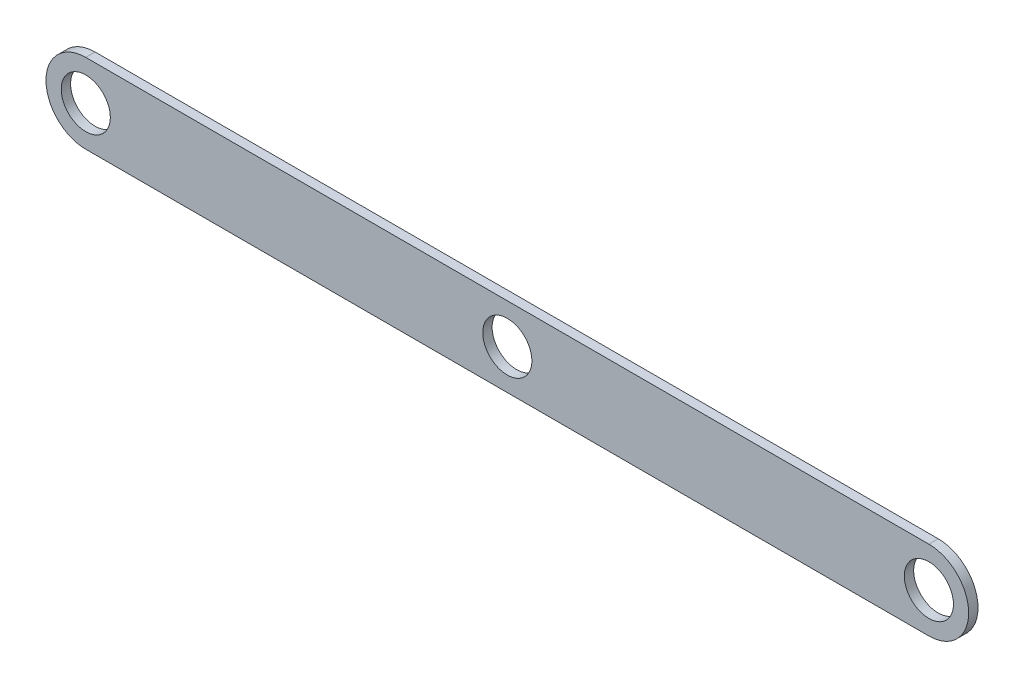
ISO-10303-21;
HEADER;
FILE_DESCRIPTION(('STEP AP214'),'2;1');
FILE_NAME('part.step','',(''),(''),'','','');
FILE_SCHEMA(('AUTOMOTIVE_DESIGN { 1 0 10303 214 1 1 1 1 }'));
ENDSEC;
DATA;
#1=APPLICATION_CONTEXT('core data for automotive mechanical design processes');
#2=APPLICATION_PROTOCOL_DEFINITION('international standard','automotive_design',2000,#1);
#3=PRODUCT_CONTEXT('',#1,'mechanical');
#4=PRODUCT('Part','Part','',(#3));
#5=PRODUCT_RELATED_PRODUCT_CATEGORY('part','',(#4));
#6=PRODUCT_DEFINITION_FORMATION('','',#4);
#7=PRODUCT_DEFINITION_CONTEXT('part definition',#1,'design');
#8=PRODUCT_DEFINITION('design','',#6,#7);
#9=PRODUCT_DEFINITION_SHAPE('','',#8);
#10=(LENGTH_UNIT() NAMED_UNIT(*) SI_UNIT(.MILLI.,.METRE.));
#11=(NAMED_UNIT(*) PLANE_ANGLE_UNIT() SI_UNIT($,.RADIAN.));
#12=(NAMED_UNIT(*) SI_UNIT($,.STERADIAN.) SOLID_ANGLE_UNIT());
#13=UNCERTAINTY_MEASURE_WITH_UNIT(LENGTH_MEASURE(1.E-05),#10,'distance_accuracy_value','');
#14=(GEOMETRIC_REPRESENTATION_CONTEXT(3) GLOBAL_UNCERTAINTY_ASSIGNED_CONTEXT((#13)) GLOBAL_UNIT_ASSIGNED_CONTEXT((#10,
#11,#12)) REPRESENTATION_CONTEXT('',''));
#15=CARTESIAN_POINT('',(0.,0.,0.));
#16=DIRECTION('',(0.,0.,1.));
#17=DIRECTION('',(1.,0.,0.));
#18=AXIS2_PLACEMENT_3D('',#15,#16,#17);
#19=CARTESIAN_POINT('',(90.1,0.,2.));
#20=DIRECTION('',(0.,0.,1.));
#21=DIRECTION('',(1.,0.,0.));
#22=AXIS2_PLACEMENT_3D('',#19,#20,#21);
#23=PLANE('',#22);
#24=CARTESIAN_POINT('',(90.1,0.,2.));
#25=DIRECTION('',(0.,0.,1.));
#26=DIRECTION('',(1.,0.,0.));
#27=AXIS2_PLACEMENT_3D('',#24,#25,#26);
#28=CIRCLE('',#27,5.25);
#29=CARTESIAN_POINT('',(95.35,0.,2.));
#30=VERTEX_POINT('',#29);
#31=EDGE_CURVE('E121',#30,#30,#28,.T.);
#32=ORIENTED_EDGE('',*,*,#31,.F.);
#33=EDGE_LOOP('',(#32));
#34=FACE_BOUND('',#33,.T.);
#35=CARTESIAN_POINT('',(90.1,0.,2.));
#36=DIRECTION('',(0.,0.,1.));
#37=DIRECTION('',(1.,0.,0.));
#38=AXIS2_PLACEMENT_3D('',#35,#36,#37);
#39=CIRCLE('',#38,8.5);
#40=CARTESIAN_POINT('',(90.1,-8.49999999999998,2.));
#41=VERTEX_POINT('',#40);
#42=CARTESIAN_POINT('',(90.1,8.50000000000002,2.));
#43=VERTEX_POINT('',#42);
#44=EDGE_CURVE('E91',#41,#43,#39,.T.);
#45=ORIENTED_EDGE('',*,*,#44,.T.);
#46=DIRECTION('',(-1.,0.,0.));
#47=VECTOR('',#46,1.);
#48=CARTESIAN_POINT('',(-90.1,8.5,2.));
#49=LINE('',#48,#47);
#50=CARTESIAN_POINT('',(-90.1,8.5,2.));
#51=VERTEX_POINT('',#50);
#52=EDGE_CURVE('E86',#43,#51,#49,.T.);
#53=ORIENTED_EDGE('',*,*,#52,.T.);
#54=CARTESIAN_POINT('',(-90.1,0.,2.));
#55=DIRECTION('',(0.,0.,1.));
#56=DIRECTION('',(1.,0.,0.));
#57=AXIS2_PLACEMENT_3D('',#54,#55,#56);
#58=CIRCLE('',#57,8.5);
#59=CARTESIAN_POINT('',(-90.1,-8.5,2.));
#60=VERTEX_POINT('',#59);
#61=EDGE_CURVE('E89',#51,#60,#58,.T.);
#62=ORIENTED_EDGE('',*,*,#61,.T.);
#63=DIRECTION('',(1.,0.,0.));
#64=VECTOR('',#63,1.);
#65=CARTESIAN_POINT('',(-90.1,-8.5,2.));
#66=LINE('',#65,#64);
#67=EDGE_CURVE('E56',#60,#41,#66,.T.);
#68=ORIENTED_EDGE('',*,*,#67,.T.);
#69=EDGE_LOOP('',(#45,#53,#62,#68));
#70=FACE_BOUND('',#69,.T.);
#71=CARTESIAN_POINT('',(-90.1,0.,2.));
#72=DIRECTION('',(0.,0.,1.));
#73=DIRECTION('',(1.,0.,0.));
#74=AXIS2_PLACEMENT_3D('',#71,#72,#73);
#75=CIRCLE('',#74,5.25);
#76=CARTESIAN_POINT('',(-84.85,0.,2.));
#77=VERTEX_POINT('',#76);
#78=EDGE_CURVE('E106',#77,#77,#75,.T.);
#79=ORIENTED_EDGE('',*,*,#78,.F.);
#80=EDGE_LOOP('',(#79));
#81=FACE_BOUND('',#80,.T.);
#82=CARTESIAN_POINT('',(0.,0.,2.));
#83=DIRECTION('',(0.,0.,1.));
#84=DIRECTION('',(1.,0.,0.));
#85=AXIS2_PLACEMENT_3D('',#82,#83,#84);
#86=CIRCLE('',#85,5.25);
#87=CARTESIAN_POINT('',(5.25,0.,2.));
#88=VERTEX_POINT('',#87);
#89=EDGE_CURVE('E127',#88,#88,#86,.T.);
#90=ORIENTED_EDGE('',*,*,#89,.F.);
#91=EDGE_LOOP('',(#90));
#92=FACE_BOUND('',#91,.T.);
#93=ADVANCED_FACE('F39',(#34,#70,#81,#92),#23,.T.);
#94=CARTESIAN_POINT('',(90.1,0.,0.));
#95=DIRECTION('',(0.,0.,1.));
#96=DIRECTION('',(1.,0.,0.));
#97=AXIS2_PLACEMENT_3D('',#94,#95,#96);
#98=PLANE('',#97);
#99=CARTESIAN_POINT('',(90.1,0.,0.));
#100=DIRECTION('',(0.,0.,1.));
#101=DIRECTION('',(1.,0.,0.));
#102=AXIS2_PLACEMENT_3D('',#99,#100,#101);
#103=CIRCLE('',#102,8.5);
#104=CARTESIAN_POINT('',(90.1,-8.49999999999998,0.));
#105=VERTEX_POINT('',#104);
#106=CARTESIAN_POINT('',(90.1,8.50000000000002,0.));
#107=VERTEX_POINT('',#106);
#108=EDGE_CURVE('E103',#105,#107,#103,.T.);
#109=ORIENTED_EDGE('',*,*,#108,.F.);
#110=DIRECTION('',(1.,0.,0.));
#111=VECTOR('',#110,1.);
#112=CARTESIAN_POINT('',(-90.1,-8.5,0.));
#113=LINE('',#112,#111);
#114=CARTESIAN_POINT('',(-90.1,-8.5,0.));
#115=VERTEX_POINT('',#114);
#116=EDGE_CURVE('E79',#115,#105,#113,.T.);
#117=ORIENTED_EDGE('',*,*,#116,.F.);
#118=CARTESIAN_POINT('',(-90.1,0.,0.));
#119=DIRECTION('',(0.,0.,1.));
#120=DIRECTION('',(1.,0.,0.));
#121=AXIS2_PLACEMENT_3D('',#118,#119,#120);
#122=CIRCLE('',#121,8.5);
#123=CARTESIAN_POINT('',(-90.1,8.5,0.));
#124=VERTEX_POINT('',#123);
#125=EDGE_CURVE('E73',#124,#115,#122,.T.);
#126=ORIENTED_EDGE('',*,*,#125,.F.);
#127=DIRECTION('',(-1.,0.,0.));
#128=VECTOR('',#127,1.);
#129=CARTESIAN_POINT('',(-90.1,8.5,0.));
#130=LINE('',#129,#128);
#131=EDGE_CURVE('E95',#107,#124,#130,.T.);
#132=ORIENTED_EDGE('',*,*,#131,.F.);
#133=EDGE_LOOP('',(#109,#117,#126,#132));
#134=FACE_BOUND('',#133,.T.);
#135=CARTESIAN_POINT('',(-90.1,0.,0.));
#136=DIRECTION('',(0.,0.,1.));
#137=DIRECTION('',(1.,0.,0.));
#138=AXIS2_PLACEMENT_3D('',#135,#136,#137);
#139=CIRCLE('',#138,5.25);
#140=CARTESIAN_POINT('',(-84.85,0.,0.));
#141=VERTEX_POINT('',#140);
#142=EDGE_CURVE('E118',#141,#141,#139,.T.);
#143=ORIENTED_EDGE('',*,*,#142,.T.);
#144=EDGE_LOOP('',(#143));
#145=FACE_BOUND('',#144,.T.);
#146=CARTESIAN_POINT('',(90.1,0.,0.));
#147=DIRECTION('',(0.,0.,1.));
#148=DIRECTION('',(1.,0.,0.));
#149=AXIS2_PLACEMENT_3D('',#146,#147,#148);
#150=CIRCLE('',#149,5.25);
#151=CARTESIAN_POINT('',(95.35,0.,0.));
#152=VERTEX_POINT('',#151);
#153=EDGE_CURVE('E124',#152,#152,#150,.T.);
#154=ORIENTED_EDGE('',*,*,#153,.T.);
#155=EDGE_LOOP('',(#154));
#156=FACE_BOUND('',#155,.T.);
#157=CARTESIAN_POINT('',(0.,0.,0.));
#158=DIRECTION('',(0.,0.,1.));
#159=DIRECTION('',(1.,0.,0.));
#160=AXIS2_PLACEMENT_3D('',#157,#158,#159);
#161=CIRCLE('',#160,5.25);
#162=CARTESIAN_POINT('',(5.25,0.,0.));
#163=VERTEX_POINT('',#162);
#164=EDGE_CURVE('E130',#163,#163,#161,.T.);
#165=ORIENTED_EDGE('',*,*,#164,.T.);
#166=EDGE_LOOP('',(#165));
#167=FACE_BOUND('',#166,.T.);
#168=ADVANCED_FACE('F114',(#134,#145,#156,#167),#98,.F.);
#169=CARTESIAN_POINT('',(90.1,0.,2.));
#170=DIRECTION('',(0.,0.,-1.));
#171=DIRECTION('',(-1.,0.,0.));
#172=AXIS2_PLACEMENT_3D('',#169,#170,#171);
#173=CYLINDRICAL_SURFACE('',#172,8.5);
#174=ORIENTED_EDGE('',*,*,#108,.T.);
#175=DIRECTION('',(0.,0.,-1.));
#176=VECTOR('',#175,1.);
#177=CARTESIAN_POINT('',(90.1,8.50000000000002,2.));
#178=LINE('',#177,#176);
#179=EDGE_CURVE('E11',#43,#107,#178,.T.);
#180=ORIENTED_EDGE('',*,*,#179,.F.);
#181=ORIENTED_EDGE('',*,*,#44,.F.);
#182=DIRECTION('',(0.,0.,-1.));
#183=VECTOR('',#182,1.);
#184=CARTESIAN_POINT('',(90.1,-8.49999999999998,2.));
#185=LINE('',#184,#183);
#186=EDGE_CURVE('E99',#41,#105,#185,.T.);
#187=ORIENTED_EDGE('',*,*,#186,.T.);
#188=EDGE_LOOP('',(#174,#180,#181,#187));
#189=FACE_BOUND('',#188,.T.);
#190=ADVANCED_FACE('F41',(#189),#173,.T.);
#191=CARTESIAN_POINT('',(-90.1,8.5,2.));
#192=DIRECTION('',(0.,-1.,0.));
#193=DIRECTION('',(1.,0.,0.));
#194=AXIS2_PLACEMENT_3D('',#191,#192,#193);
#195=PLANE('',#194);
#196=ORIENTED_EDGE('',*,*,#131,.T.);
#197=DIRECTION('',(0.,0.,-1.));
#198=VECTOR('',#197,1.);
#199=CARTESIAN_POINT('',(-90.1,8.5,2.));
#200=LINE('',#199,#198);
#201=EDGE_CURVE('E48',#51,#124,#200,.T.);
#202=ORIENTED_EDGE('',*,*,#201,.F.);
#203=ORIENTED_EDGE('',*,*,#52,.F.);
#204=ORIENTED_EDGE('',*,*,#179,.T.);
#205=EDGE_LOOP('',(#196,#202,#203,#204));
#206=FACE_BOUND('',#205,.T.);
#207=ADVANCED_FACE('F94',(#206),#195,.F.);
#208=CARTESIAN_POINT('',(-90.1,0.,2.));
#209=DIRECTION('',(0.,0.,-1.));
#210=DIRECTION('',(-1.,0.,0.));
#211=AXIS2_PLACEMENT_3D('',#208,#209,#210);
#212=CYLINDRICAL_SURFACE('',#211,8.5);
#213=ORIENTED_EDGE('',*,*,#125,.T.);
#214=DIRECTION('',(0.,0.,-1.));
#215=VECTOR('',#214,1.);
#216=CARTESIAN_POINT('',(-90.1,-8.5,2.));
#217=LINE('',#216,#215);
#218=EDGE_CURVE('E96',#60,#115,#217,.T.);
#219=ORIENTED_EDGE('',*,*,#218,.F.);
#220=ORIENTED_EDGE('',*,*,#61,.F.);
#221=ORIENTED_EDGE('',*,*,#201,.T.);
#222=EDGE_LOOP('',(#213,#219,#220,#221));
#223=FACE_BOUND('',#222,.T.);
#224=ADVANCED_FACE('F97',(#223),#212,.T.);
#225=CARTESIAN_POINT('',(-90.1,-8.5,2.));
#226=DIRECTION('',(0.,1.,0.));
#227=DIRECTION('',(-1.,0.,0.));
#228=AXIS2_PLACEMENT_3D('',#225,#226,#227);
#229=PLANE('',#228);
#230=ORIENTED_EDGE('',*,*,#116,.T.);
#231=ORIENTED_EDGE('',*,*,#186,.F.);
#232=ORIENTED_EDGE('',*,*,#67,.F.);
#233=ORIENTED_EDGE('',*,*,#218,.T.);
#234=EDGE_LOOP('',(#230,#231,#232,#233));
#235=FACE_BOUND('',#234,.T.);
#236=ADVANCED_FACE('F111',(#235),#229,.F.);
#237=CARTESIAN_POINT('',(-90.1,0.,2.));
#238=DIRECTION('',(0.,0.,-1.));
#239=DIRECTION('',(-1.,0.,0.));
#240=AXIS2_PLACEMENT_3D('',#237,#238,#239);
#241=CYLINDRICAL_SURFACE('',#240,5.25);
#242=ORIENTED_EDGE('',*,*,#78,.T.);
#243=EDGE_LOOP('',(#242));
#244=FACE_BOUND('',#243,.T.);
#245=ORIENTED_EDGE('',*,*,#142,.F.);
#246=EDGE_LOOP('',(#245));
#247=FACE_BOUND('',#246,.T.);
#248=ADVANCED_FACE('F148',(#244,#247),#241,.F.);
#249=CARTESIAN_POINT('',(90.1,0.,2.));
#250=DIRECTION('',(0.,0.,-1.));
#251=DIRECTION('',(-1.,0.,0.));
#252=AXIS2_PLACEMENT_3D('',#249,#250,#251);
#253=CYLINDRICAL_SURFACE('',#252,5.25);
#254=ORIENTED_EDGE('',*,*,#31,.T.);
#255=EDGE_LOOP('',(#254));
#256=FACE_BOUND('',#255,.T.);
#257=ORIENTED_EDGE('',*,*,#153,.F.);
#258=EDGE_LOOP('',(#257));
#259=FACE_BOUND('',#258,.T.);
#260=ADVANCED_FACE('F193',(#256,#259),#253,.F.);
#261=CARTESIAN_POINT('',(0.,0.,2.));
#262=DIRECTION('',(0.,0.,-1.));
#263=DIRECTION('',(-1.,0.,0.));
#264=AXIS2_PLACEMENT_3D('',#261,#262,#263);
#265=CYLINDRICAL_SURFACE('',#264,5.25);
#266=ORIENTED_EDGE('',*,*,#89,.T.);
#267=EDGE_LOOP('',(#266));
#268=FACE_BOUND('',#267,.T.);
#269=ORIENTED_EDGE('',*,*,#164,.F.);
#270=EDGE_LOOP('',(#269));
#271=FACE_BOUND('',#270,.T.);
#272=ADVANCED_FACE('F136',(#268,#271),#265,.F.);
#273=CLOSED_SHELL('',(#93,#168,#190,#207,#224,#236,#248,#260,#272));
#274=MANIFOLD_SOLID_BREP('B2',#273);
#275=ADVANCED_BREP_SHAPE_REPRESENTATION('',(#18,#274),#14);
#276=SHAPE_DEFINITION_REPRESENTATION(#9,#275);
ENDSEC;
END-ISO-10303-21;
